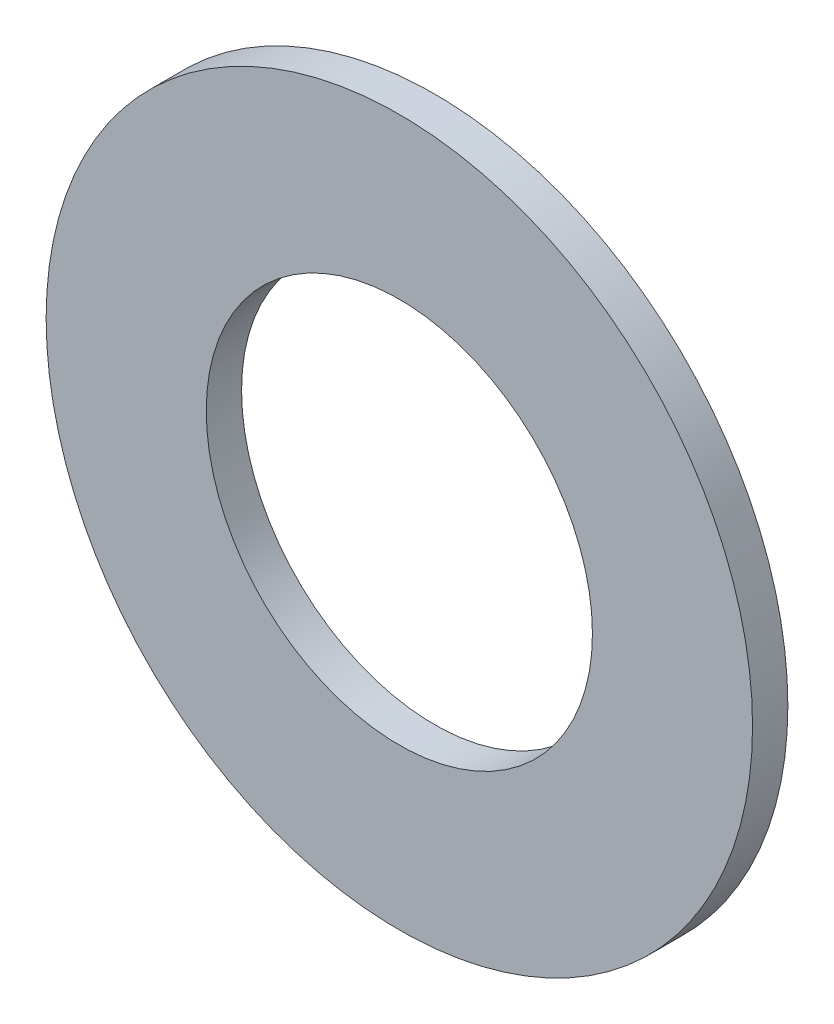
ISO-10303-21;
HEADER;
FILE_DESCRIPTION(('STEP AP214'),'2;1');
FILE_NAME('part.step','',(''),(''),'','','');
FILE_SCHEMA(('AUTOMOTIVE_DESIGN { 1 0 10303 214 1 1 1 1 }'));
ENDSEC;
DATA;
#1=APPLICATION_CONTEXT('core data for automotive mechanical design processes');
#2=APPLICATION_PROTOCOL_DEFINITION('international standard','automotive_design',2000,#1);
#3=PRODUCT_CONTEXT('',#1,'mechanical');
#4=PRODUCT('Part','Part','',(#3));
#5=PRODUCT_RELATED_PRODUCT_CATEGORY('part','',(#4));
#6=PRODUCT_DEFINITION_FORMATION('','',#4);
#7=PRODUCT_DEFINITION_CONTEXT('part definition',#1,'design');
#8=PRODUCT_DEFINITION('design','',#6,#7);
#9=PRODUCT_DEFINITION_SHAPE('','',#8);
#10=(LENGTH_UNIT() NAMED_UNIT(*) SI_UNIT(.MILLI.,.METRE.));
#11=(NAMED_UNIT(*) PLANE_ANGLE_UNIT() SI_UNIT($,.RADIAN.));
#12=(NAMED_UNIT(*) SI_UNIT($,.STERADIAN.) SOLID_ANGLE_UNIT());
#13=UNCERTAINTY_MEASURE_WITH_UNIT(LENGTH_MEASURE(1.E-05),#10,'distance_accuracy_value','');
#14=(GEOMETRIC_REPRESENTATION_CONTEXT(3) GLOBAL_UNCERTAINTY_ASSIGNED_CONTEXT((#13)) GLOBAL_UNIT_ASSIGNED_CONTEXT((#10,
#11,#12)) REPRESENTATION_CONTEXT('',''));
#15=CARTESIAN_POINT('',(0.,0.,0.));
#16=DIRECTION('',(0.,0.,1.));
#17=DIRECTION('',(1.,0.,0.));
#18=AXIS2_PLACEMENT_3D('',#15,#16,#17);
#19=CARTESIAN_POINT('',(0.,0.,0.75));
#20=DIRECTION('',(0.,0.,1.));
#21=DIRECTION('',(1.,0.,0.));
#22=AXIS2_PLACEMENT_3D('',#19,#20,#21);
#23=PLANE('',#22);
#24=CARTESIAN_POINT('',(0.,0.,0.75));
#25=DIRECTION('',(0.,0.,1.));
#26=DIRECTION('',(1.,0.,0.));
#27=AXIS2_PLACEMENT_3D('',#24,#25,#26);
#28=CIRCLE('',#27,7.5);
#29=CARTESIAN_POINT('',(7.5,0.,0.75));
#30=VERTEX_POINT('',#29);
#31=EDGE_CURVE('E10',#30,#30,#28,.T.);
#32=ORIENTED_EDGE('',*,*,#31,.T.);
#33=EDGE_LOOP('',(#32));
#34=FACE_BOUND('',#33,.T.);
#35=CARTESIAN_POINT('',(0.,0.,0.75));
#36=DIRECTION('',(0.,0.,1.));
#37=DIRECTION('',(1.,0.,0.));
#38=AXIS2_PLACEMENT_3D('',#35,#36,#37);
#39=CIRCLE('',#38,4.1);
#40=CARTESIAN_POINT('',(4.1,0.,0.75));
#41=VERTEX_POINT('',#40);
#42=EDGE_CURVE('E42',#41,#41,#39,.T.);
#43=ORIENTED_EDGE('',*,*,#42,.F.);
#44=EDGE_LOOP('',(#43));
#45=FACE_BOUND('',#44,.T.);
#46=ADVANCED_FACE('F31',(#34,#45),#23,.T.);
#47=CARTESIAN_POINT('',(0.,0.,0.));
#48=DIRECTION('',(0.,0.,1.));
#49=DIRECTION('',(1.,0.,0.));
#50=AXIS2_PLACEMENT_3D('',#47,#48,#49);
#51=PLANE('',#50);
#52=CARTESIAN_POINT('',(0.,0.,0.));
#53=DIRECTION('',(0.,0.,1.));
#54=DIRECTION('',(1.,0.,0.));
#55=AXIS2_PLACEMENT_3D('',#52,#53,#54);
#56=CIRCLE('',#55,7.5);
#57=CARTESIAN_POINT('',(7.5,0.,0.));
#58=VERTEX_POINT('',#57);
#59=EDGE_CURVE('E35',#58,#58,#56,.T.);
#60=ORIENTED_EDGE('',*,*,#59,.F.);
#61=EDGE_LOOP('',(#60));
#62=FACE_BOUND('',#61,.T.);
#63=CARTESIAN_POINT('',(0.,0.,0.));
#64=DIRECTION('',(0.,0.,1.));
#65=DIRECTION('',(1.,0.,0.));
#66=AXIS2_PLACEMENT_3D('',#63,#64,#65);
#67=CIRCLE('',#66,4.1);
#68=CARTESIAN_POINT('',(4.1,0.,0.));
#69=VERTEX_POINT('',#68);
#70=EDGE_CURVE('E44',#69,#69,#67,.T.);
#71=ORIENTED_EDGE('',*,*,#70,.T.);
#72=EDGE_LOOP('',(#71));
#73=FACE_BOUND('',#72,.T.);
#74=ADVANCED_FACE('F54',(#62,#73),#51,.F.);
#75=CARTESIAN_POINT('',(0.,0.,0.75));
#76=DIRECTION('',(0.,0.,-1.));
#77=DIRECTION('',(-1.,0.,0.));
#78=AXIS2_PLACEMENT_3D('',#75,#76,#77);
#79=CYLINDRICAL_SURFACE('',#78,7.5);
#80=ORIENTED_EDGE('',*,*,#31,.F.);
#81=EDGE_LOOP('',(#80));
#82=FACE_BOUND('',#81,.T.);
#83=ORIENTED_EDGE('',*,*,#59,.T.);
#84=EDGE_LOOP('',(#83));
#85=FACE_BOUND('',#84,.T.);
#86=ADVANCED_FACE('F33',(#82,#85),#79,.T.);
#87=CARTESIAN_POINT('',(0.,0.,0.75));
#88=DIRECTION('',(0.,0.,-1.));
#89=DIRECTION('',(-1.,0.,0.));
#90=AXIS2_PLACEMENT_3D('',#87,#88,#89);
#91=CYLINDRICAL_SURFACE('',#90,4.1);
#92=ORIENTED_EDGE('',*,*,#42,.T.);
#93=EDGE_LOOP('',(#92));
#94=FACE_BOUND('',#93,.T.);
#95=ORIENTED_EDGE('',*,*,#70,.F.);
#96=EDGE_LOOP('',(#95));
#97=FACE_BOUND('',#96,.T.);
#98=ADVANCED_FACE('F50',(#94,#97),#91,.F.);
#99=CLOSED_SHELL('',(#46,#74,#86,#98));
#100=MANIFOLD_SOLID_BREP('B2',#99);
#101=ADVANCED_BREP_SHAPE_REPRESENTATION('',(#18,#100),#14);
#102=SHAPE_DEFINITION_REPRESENTATION(#9,#101);
ENDSEC;
END-ISO-10303-21;
